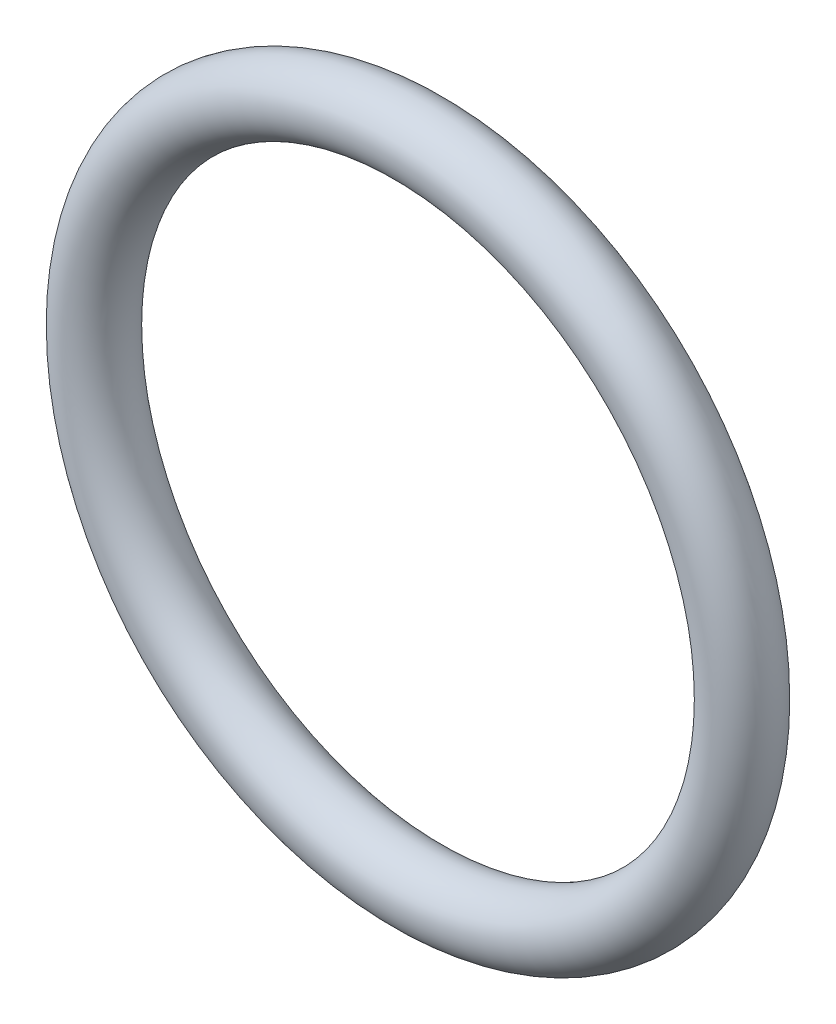
ISO-10303-21;
HEADER;
FILE_DESCRIPTION(('STEP AP214'),'2;1');
FILE_NAME('part.step','',(''),(''),'','','');
FILE_SCHEMA(('AUTOMOTIVE_DESIGN { 1 0 10303 214 1 1 1 1 }'));
ENDSEC;
DATA;
#1=APPLICATION_CONTEXT('core data for automotive mechanical design processes');
#2=APPLICATION_PROTOCOL_DEFINITION('international standard','automotive_design',2000,#1);
#3=PRODUCT_CONTEXT('',#1,'mechanical');
#4=PRODUCT('Part','Part','',(#3));
#5=PRODUCT_RELATED_PRODUCT_CATEGORY('part','',(#4));
#6=PRODUCT_DEFINITION_FORMATION('','',#4);
#7=PRODUCT_DEFINITION_CONTEXT('part definition',#1,'design');
#8=PRODUCT_DEFINITION('design','',#6,#7);
#9=PRODUCT_DEFINITION_SHAPE('','',#8);
#10=(LENGTH_UNIT() NAMED_UNIT(*) SI_UNIT(.MILLI.,.METRE.));
#11=(NAMED_UNIT(*) PLANE_ANGLE_UNIT() SI_UNIT($,.RADIAN.));
#12=(NAMED_UNIT(*) SI_UNIT($,.STERADIAN.) SOLID_ANGLE_UNIT());
#13=UNCERTAINTY_MEASURE_WITH_UNIT(LENGTH_MEASURE(1.E-05),#10,'distance_accuracy_value','');
#14=(GEOMETRIC_REPRESENTATION_CONTEXT(3) GLOBAL_UNCERTAINTY_ASSIGNED_CONTEXT((#13)) GLOBAL_UNIT_ASSIGNED_CONTEXT((#10,
#11,#12)) REPRESENTATION_CONTEXT('',''));
#15=CARTESIAN_POINT('',(0.,0.,0.));
#16=DIRECTION('',(0.,0.,1.));
#17=DIRECTION('',(1.,0.,0.));
#18=AXIS2_PLACEMENT_3D('',#15,#16,#17);
#19=CARTESIAN_POINT('',(0.,0.,0.));
#20=DIRECTION('',(0.,0.,1.));
#21=DIRECTION('',(1.,0.,0.));
#22=AXIS2_PLACEMENT_3D('',#19,#20,#21);
#23=TOROIDAL_SURFACE('',#22,6.,0.625);
#24=CARTESIAN_POINT('',(6.625,0.,0.));
#25=VERTEX_POINT('',#24);
#26=VERTEX_LOOP('',#25);
#27=FACE_BOUND('',#26,.T.);
#28=ADVANCED_FACE('F41',(#27),#23,.T.);
#29=CLOSED_SHELL('',(#28));
#30=MANIFOLD_SOLID_BREP('B2',#29);
#31=ADVANCED_BREP_SHAPE_REPRESENTATION('',(#18,#30),#14);
#32=SHAPE_DEFINITION_REPRESENTATION(#9,#31);
ENDSEC;
END-ISO-10303-21;
